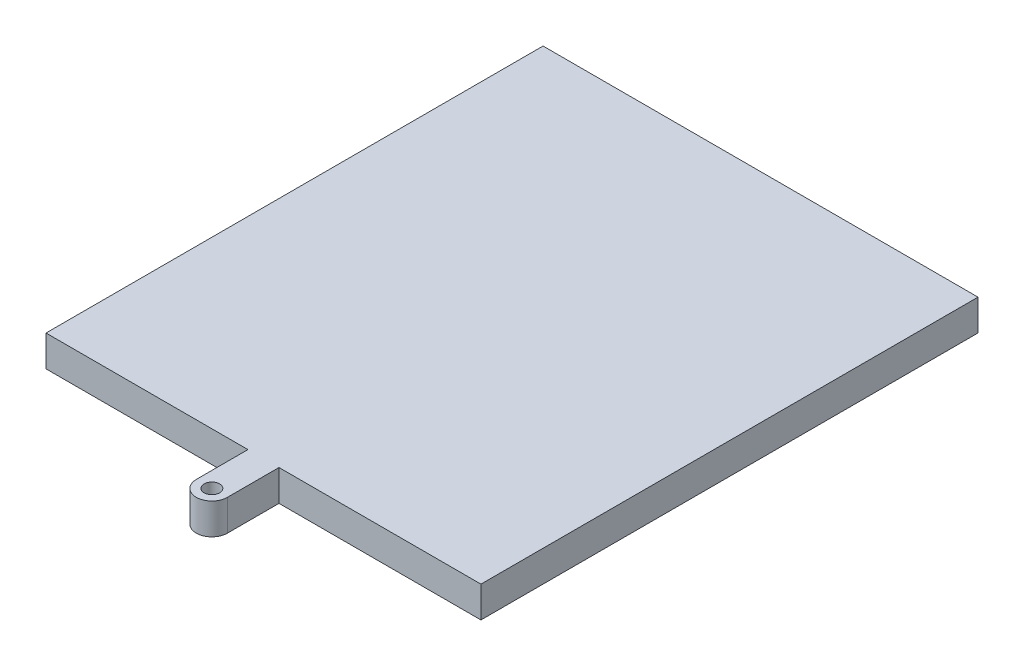
ISO-10303-21;
HEADER;
FILE_DESCRIPTION(('STEP AP214'),'2;1');
FILE_NAME('part.step','',(''),(''),'','','');
FILE_SCHEMA(('AUTOMOTIVE_DESIGN { 1 0 10303 214 1 1 1 1 }'));
ENDSEC;
DATA;
#1=APPLICATION_CONTEXT('core data for automotive mechanical design processes');
#2=APPLICATION_PROTOCOL_DEFINITION('international standard','automotive_design',2000,#1);
#3=PRODUCT_CONTEXT('',#1,'mechanical');
#4=PRODUCT('Part','Part','',(#3));
#5=PRODUCT_RELATED_PRODUCT_CATEGORY('part','',(#4));
#6=PRODUCT_DEFINITION_FORMATION('','',#4);
#7=PRODUCT_DEFINITION_CONTEXT('part definition',#1,'design');
#8=PRODUCT_DEFINITION('design','',#6,#7);
#9=PRODUCT_DEFINITION_SHAPE('','',#8);
#10=(LENGTH_UNIT() NAMED_UNIT(*) SI_UNIT(.MILLI.,.METRE.));
#11=(NAMED_UNIT(*) PLANE_ANGLE_UNIT() SI_UNIT($,.RADIAN.));
#12=(NAMED_UNIT(*) SI_UNIT($,.STERADIAN.) SOLID_ANGLE_UNIT());
#13=UNCERTAINTY_MEASURE_WITH_UNIT(LENGTH_MEASURE(1.E-05),#10,'distance_accuracy_value','');
#14=(GEOMETRIC_REPRESENTATION_CONTEXT(3) GLOBAL_UNCERTAINTY_ASSIGNED_CONTEXT((#13)) GLOBAL_UNIT_ASSIGNED_CONTEXT((#10,
#11,#12)) REPRESENTATION_CONTEXT('',''));
#15=CARTESIAN_POINT('',(0.,0.,0.));
#16=DIRECTION('',(0.,0.,1.));
#17=DIRECTION('',(1.,0.,0.));
#18=AXIS2_PLACEMENT_3D('',#15,#16,#17);
#19=CARTESIAN_POINT('',(-70.,5.,0.));
#20=DIRECTION('',(1.,0.,0.));
#21=DIRECTION('',(0.,0.,-1.));
#22=AXIS2_PLACEMENT_3D('',#19,#20,#21);
#23=PLANE('',#22);
#24=DIRECTION('',(0.,0.,1.));
#25=VECTOR('',#24,1.);
#26=CARTESIAN_POINT('',(-70.,0.,0.));
#27=LINE('',#26,#25);
#28=CARTESIAN_POINT('',(-70.,0.,0.));
#29=VERTEX_POINT('',#28);
#30=CARTESIAN_POINT('',(-70.,0.,80.));
#31=VERTEX_POINT('',#30);
#32=EDGE_CURVE('E134',#29,#31,#27,.T.);
#33=ORIENTED_EDGE('',*,*,#32,.T.);
#34=DIRECTION('',(0.,-1.,0.));
#35=VECTOR('',#34,1.);
#36=CARTESIAN_POINT('',(-70.,5.,80.));
#37=LINE('',#36,#35);
#38=CARTESIAN_POINT('',(-70.,5.,80.));
#39=VERTEX_POINT('',#38);
#40=EDGE_CURVE('E11',#39,#31,#37,.T.);
#41=ORIENTED_EDGE('',*,*,#40,.F.);
#42=DIRECTION('',(0.,0.,1.));
#43=VECTOR('',#42,1.);
#44=CARTESIAN_POINT('',(-70.,5.,0.));
#45=LINE('',#44,#43);
#46=CARTESIAN_POINT('',(-70.,5.,0.));
#47=VERTEX_POINT('',#46);
#48=EDGE_CURVE('E87',#47,#39,#45,.T.);
#49=ORIENTED_EDGE('',*,*,#48,.F.);
#50=DIRECTION('',(0.,-1.,0.));
#51=VECTOR('',#50,1.);
#52=CARTESIAN_POINT('',(-70.,5.,0.));
#53=LINE('',#52,#51);
#54=EDGE_CURVE('E133',#47,#29,#53,.T.);
#55=ORIENTED_EDGE('',*,*,#54,.T.);
#56=EDGE_LOOP('',(#33,#41,#49,#55));
#57=FACE_BOUND('',#56,.T.);
#58=ADVANCED_FACE('F35',(#57),#23,.F.);
#59=CARTESIAN_POINT('',(0.,5.,80.));
#60=DIRECTION('',(0.,0.,1.));
#61=DIRECTION('',(1.,0.,0.));
#62=AXIS2_PLACEMENT_3D('',#59,#60,#61);
#63=PLANE('',#62);
#64=DIRECTION('',(-1.,0.,0.));
#65=VECTOR('',#64,1.);
#66=CARTESIAN_POINT('',(0.,0.,80.));
#67=LINE('',#66,#65);
#68=CARTESIAN_POINT('',(-37.5,0.,80.));
#69=VERTEX_POINT('',#68);
#70=EDGE_CURVE('E137',#69,#31,#67,.T.);
#71=ORIENTED_EDGE('',*,*,#70,.F.);
#72=DIRECTION('',(0.,-1.,0.));
#73=VECTOR('',#72,1.);
#74=CARTESIAN_POINT('',(-37.5,5.,80.));
#75=LINE('',#74,#73);
#76=CARTESIAN_POINT('',(-37.5,5.,80.));
#77=VERTEX_POINT('',#76);
#78=EDGE_CURVE('E43',#77,#69,#75,.T.);
#79=ORIENTED_EDGE('',*,*,#78,.F.);
#80=DIRECTION('',(-1.,0.,0.));
#81=VECTOR('',#80,1.);
#82=CARTESIAN_POINT('',(0.,5.,80.));
#83=LINE('',#82,#81);
#84=EDGE_CURVE('E123',#77,#39,#83,.T.);
#85=ORIENTED_EDGE('',*,*,#84,.T.);
#86=ORIENTED_EDGE('',*,*,#40,.T.);
#87=EDGE_LOOP('',(#71,#79,#85,#86));
#88=FACE_BOUND('',#87,.T.);
#89=ADVANCED_FACE('F170',(#88),#63,.T.);
#90=CARTESIAN_POINT('',(-37.5,5.,0.));
#91=DIRECTION('',(-1.,0.,0.));
#92=DIRECTION('',(0.,0.,1.));
#93=AXIS2_PLACEMENT_3D('',#90,#91,#92);
#94=PLANE('',#93);
#95=DIRECTION('',(0.,0.,-1.));
#96=VECTOR('',#95,1.);
#97=CARTESIAN_POINT('',(-37.5,0.,0.));
#98=LINE('',#97,#96);
#99=CARTESIAN_POINT('',(-37.5,0.,88.3053705332621));
#100=VERTEX_POINT('',#99);
#101=EDGE_CURVE('E140',#100,#69,#98,.T.);
#102=ORIENTED_EDGE('',*,*,#101,.F.);
#103=DIRECTION('',(0.,-1.,0.));
#104=VECTOR('',#103,1.);
#105=CARTESIAN_POINT('',(-37.5,5.,88.3053705332621));
#106=LINE('',#105,#104);
#107=CARTESIAN_POINT('',(-37.5,5.,88.3053705332621));
#108=VERTEX_POINT('',#107);
#109=EDGE_CURVE('E160',#108,#100,#106,.T.);
#110=ORIENTED_EDGE('',*,*,#109,.F.);
#111=DIRECTION('',(0.,0.,-1.));
#112=VECTOR('',#111,1.);
#113=CARTESIAN_POINT('',(-37.5,5.,0.));
#114=LINE('',#113,#112);
#115=EDGE_CURVE('E167',#108,#77,#114,.T.);
#116=ORIENTED_EDGE('',*,*,#115,.T.);
#117=ORIENTED_EDGE('',*,*,#78,.T.);
#118=EDGE_LOOP('',(#102,#110,#116,#117));
#119=FACE_BOUND('',#118,.T.);
#120=ADVANCED_FACE('F165',(#119),#94,.T.);
#121=CARTESIAN_POINT('',(-35.,5.,88.3053705332621));
#122=DIRECTION('',(0.,-1.,0.));
#123=DIRECTION('',(0.,0.,-1.));
#124=AXIS2_PLACEMENT_3D('',#121,#122,#123);
#125=CYLINDRICAL_SURFACE('',#124,2.5);
#126=CARTESIAN_POINT('',(-35.,0.,88.3053705332621));
#127=DIRECTION('',(0.,1.,0.));
#128=DIRECTION('',(0.,0.,1.));
#129=AXIS2_PLACEMENT_3D('',#126,#127,#128);
#130=CIRCLE('',#129,2.5);
#131=CARTESIAN_POINT('',(-32.5,0.,88.3053705332621));
#132=VERTEX_POINT('',#131);
#133=EDGE_CURVE('E143',#100,#132,#130,.T.);
#134=ORIENTED_EDGE('',*,*,#133,.T.);
#135=DIRECTION('',(0.,-1.,0.));
#136=VECTOR('',#135,1.);
#137=CARTESIAN_POINT('',(-32.5,5.,88.3053705332621));
#138=LINE('',#137,#136);
#139=CARTESIAN_POINT('',(-32.5,5.,88.3053705332621));
#140=VERTEX_POINT('',#139);
#141=EDGE_CURVE('E157',#140,#132,#138,.T.);
#142=ORIENTED_EDGE('',*,*,#141,.F.);
#143=CARTESIAN_POINT('',(-35.,5.,88.3053705332621));
#144=DIRECTION('',(0.,1.,0.));
#145=DIRECTION('',(0.,0.,1.));
#146=AXIS2_PLACEMENT_3D('',#143,#144,#145);
#147=CIRCLE('',#146,2.5);
#148=EDGE_CURVE('E183',#108,#140,#147,.T.);
#149=ORIENTED_EDGE('',*,*,#148,.F.);
#150=ORIENTED_EDGE('',*,*,#109,.T.);
#151=EDGE_LOOP('',(#134,#142,#149,#150));
#152=FACE_BOUND('',#151,.T.);
#153=ADVANCED_FACE('F179',(#152),#125,.T.);
#154=CARTESIAN_POINT('',(-32.5,5.,0.));
#155=DIRECTION('',(-1.,0.,0.));
#156=DIRECTION('',(0.,0.,1.));
#157=AXIS2_PLACEMENT_3D('',#154,#155,#156);
#158=PLANE('',#157);
#159=DIRECTION('',(0.,0.,-1.));
#160=VECTOR('',#159,1.);
#161=CARTESIAN_POINT('',(-32.5,0.,0.));
#162=LINE('',#161,#160);
#163=CARTESIAN_POINT('',(-32.5,0.,80.));
#164=VERTEX_POINT('',#163);
#165=EDGE_CURVE('E145',#132,#164,#162,.T.);
#166=ORIENTED_EDGE('',*,*,#165,.T.);
#167=DIRECTION('',(0.,-1.,0.));
#168=VECTOR('',#167,1.);
#169=CARTESIAN_POINT('',(-32.5,5.,80.));
#170=LINE('',#169,#168);
#171=CARTESIAN_POINT('',(-32.5,5.,80.));
#172=VERTEX_POINT('',#171);
#173=EDGE_CURVE('E114',#172,#164,#170,.T.);
#174=ORIENTED_EDGE('',*,*,#173,.F.);
#175=DIRECTION('',(0.,0.,-1.));
#176=VECTOR('',#175,1.);
#177=CARTESIAN_POINT('',(-32.5,5.,0.));
#178=LINE('',#177,#176);
#179=EDGE_CURVE('E120',#140,#172,#178,.T.);
#180=ORIENTED_EDGE('',*,*,#179,.F.);
#181=ORIENTED_EDGE('',*,*,#141,.T.);
#182=EDGE_LOOP('',(#166,#174,#180,#181));
#183=FACE_BOUND('',#182,.T.);
#184=ADVANCED_FACE('F182',(#183),#158,.F.);
#185=CARTESIAN_POINT('',(0.,0.,80.));
#186=VERTEX_POINT('',#185);
#187=EDGE_CURVE('E109',#186,#164,#67,.T.);
#188=ORIENTED_EDGE('',*,*,#187,.F.);
#189=DIRECTION('',(0.,-1.,0.));
#190=VECTOR('',#189,1.);
#191=CARTESIAN_POINT('',(0.,5.,80.));
#192=LINE('',#191,#190);
#193=CARTESIAN_POINT('',(0.,5.,80.));
#194=VERTEX_POINT('',#193);
#195=EDGE_CURVE('E104',#194,#186,#192,.T.);
#196=ORIENTED_EDGE('',*,*,#195,.F.);
#197=EDGE_CURVE('E107',#194,#172,#83,.T.);
#198=ORIENTED_EDGE('',*,*,#197,.T.);
#199=ORIENTED_EDGE('',*,*,#173,.T.);
#200=EDGE_LOOP('',(#188,#196,#198,#199));
#201=FACE_BOUND('',#200,.T.);
#202=ADVANCED_FACE('F106',(#201),#63,.T.);
#203=CARTESIAN_POINT('',(0.,5.,0.));
#204=DIRECTION('',(1.,0.,0.));
#205=DIRECTION('',(0.,0.,-1.));
#206=AXIS2_PLACEMENT_3D('',#203,#204,#205);
#207=PLANE('',#206);
#208=DIRECTION('',(0.,0.,1.));
#209=VECTOR('',#208,1.);
#210=CARTESIAN_POINT('',(0.,0.,0.));
#211=LINE('',#210,#209);
#212=CARTESIAN_POINT('',(0.,0.,0.));
#213=VERTEX_POINT('',#212);
#214=EDGE_CURVE('E148',#213,#186,#211,.T.);
#215=ORIENTED_EDGE('',*,*,#214,.F.);
#216=DIRECTION('',(0.,-1.,0.));
#217=VECTOR('',#216,1.);
#218=CARTESIAN_POINT('',(0.,5.,0.));
#219=LINE('',#218,#217);
#220=CARTESIAN_POINT('',(0.,5.,0.));
#221=VERTEX_POINT('',#220);
#222=EDGE_CURVE('E78',#221,#213,#219,.T.);
#223=ORIENTED_EDGE('',*,*,#222,.F.);
#224=DIRECTION('',(0.,0.,1.));
#225=VECTOR('',#224,1.);
#226=CARTESIAN_POINT('',(0.,5.,0.));
#227=LINE('',#226,#225);
#228=EDGE_CURVE('E118',#221,#194,#227,.T.);
#229=ORIENTED_EDGE('',*,*,#228,.T.);
#230=ORIENTED_EDGE('',*,*,#195,.T.);
#231=EDGE_LOOP('',(#215,#223,#229,#230));
#232=FACE_BOUND('',#231,.T.);
#233=ADVANCED_FACE('F124',(#232),#207,.T.);
#234=CARTESIAN_POINT('',(0.,5.,0.));
#235=DIRECTION('',(0.,0.,1.));
#236=DIRECTION('',(1.,0.,0.));
#237=AXIS2_PLACEMENT_3D('',#234,#235,#236);
#238=PLANE('',#237);
#239=DIRECTION('',(-1.,0.,0.));
#240=VECTOR('',#239,1.);
#241=CARTESIAN_POINT('',(0.,0.,0.));
#242=LINE('',#241,#240);
#243=EDGE_CURVE('E81',#213,#29,#242,.T.);
#244=ORIENTED_EDGE('',*,*,#243,.T.);
#245=ORIENTED_EDGE('',*,*,#54,.F.);
#246=DIRECTION('',(-1.,0.,0.));
#247=VECTOR('',#246,1.);
#248=CARTESIAN_POINT('',(0.,5.,0.));
#249=LINE('',#248,#247);
#250=EDGE_CURVE('E51',#221,#47,#249,.T.);
#251=ORIENTED_EDGE('',*,*,#250,.F.);
#252=ORIENTED_EDGE('',*,*,#222,.T.);
#253=EDGE_LOOP('',(#244,#245,#251,#252));
#254=FACE_BOUND('',#253,.T.);
#255=ADVANCED_FACE('F187',(#254),#238,.F.);
#256=CARTESIAN_POINT('',(-35.,5.,88.3053705332621));
#257=DIRECTION('',(0.,-1.,0.));
#258=DIRECTION('',(0.,0.,-1.));
#259=AXIS2_PLACEMENT_3D('',#256,#257,#258);
#260=CYLINDRICAL_SURFACE('',#259,1.25);
#261=CARTESIAN_POINT('',(-35.,5.,88.3053705332621));
#262=DIRECTION('',(0.,1.,0.));
#263=DIRECTION('',(0.,0.,1.));
#264=AXIS2_PLACEMENT_3D('',#261,#262,#263);
#265=CIRCLE('',#264,1.25);
#266=CARTESIAN_POINT('',(-35.,5.,89.5553705332621));
#267=VERTEX_POINT('',#266);
#268=EDGE_CURVE('E126',#267,#267,#265,.T.);
#269=ORIENTED_EDGE('',*,*,#268,.T.);
#270=EDGE_LOOP('',(#269));
#271=FACE_BOUND('',#270,.T.);
#272=CARTESIAN_POINT('',(-35.,0.,88.3053705332621));
#273=DIRECTION('',(0.,1.,0.));
#274=DIRECTION('',(0.,0.,1.));
#275=AXIS2_PLACEMENT_3D('',#272,#273,#274);
#276=CIRCLE('',#275,1.25);
#277=CARTESIAN_POINT('',(-35.,0.,89.5553705332621));
#278=VERTEX_POINT('',#277);
#279=EDGE_CURVE('E151',#278,#278,#276,.T.);
#280=ORIENTED_EDGE('',*,*,#279,.F.);
#281=EDGE_LOOP('',(#280));
#282=FACE_BOUND('',#281,.T.);
#283=ADVANCED_FACE('F189',(#271,#282),#260,.F.);
#284=CARTESIAN_POINT('',(0.,5.,0.));
#285=DIRECTION('',(0.,1.,0.));
#286=DIRECTION('',(0.,0.,1.));
#287=AXIS2_PLACEMENT_3D('',#284,#285,#286);
#288=PLANE('',#287);
#289=ORIENTED_EDGE('',*,*,#48,.T.);
#290=ORIENTED_EDGE('',*,*,#84,.F.);
#291=ORIENTED_EDGE('',*,*,#115,.F.);
#292=ORIENTED_EDGE('',*,*,#148,.T.);
#293=ORIENTED_EDGE('',*,*,#179,.T.);
#294=ORIENTED_EDGE('',*,*,#197,.F.);
#295=ORIENTED_EDGE('',*,*,#228,.F.);
#296=ORIENTED_EDGE('',*,*,#250,.T.);
#297=EDGE_LOOP('',(#289,#290,#291,#292,#293,#294,#295,#296));
#298=FACE_BOUND('',#297,.T.);
#299=ORIENTED_EDGE('',*,*,#268,.F.);
#300=EDGE_LOOP('',(#299));
#301=FACE_BOUND('',#300,.T.);
#302=ADVANCED_FACE('F116',(#298,#301),#288,.T.);
#303=CARTESIAN_POINT('',(0.,0.,0.));
#304=DIRECTION('',(0.,1.,0.));
#305=DIRECTION('',(0.,0.,1.));
#306=AXIS2_PLACEMENT_3D('',#303,#304,#305);
#307=PLANE('',#306);
#308=ORIENTED_EDGE('',*,*,#32,.F.);
#309=ORIENTED_EDGE('',*,*,#243,.F.);
#310=ORIENTED_EDGE('',*,*,#214,.T.);
#311=ORIENTED_EDGE('',*,*,#187,.T.);
#312=ORIENTED_EDGE('',*,*,#165,.F.);
#313=ORIENTED_EDGE('',*,*,#133,.F.);
#314=ORIENTED_EDGE('',*,*,#101,.T.);
#315=ORIENTED_EDGE('',*,*,#70,.T.);
#316=EDGE_LOOP('',(#308,#309,#310,#311,#312,#313,#314,#315));
#317=FACE_BOUND('',#316,.T.);
#318=ORIENTED_EDGE('',*,*,#279,.T.);
#319=EDGE_LOOP('',(#318));
#320=FACE_BOUND('',#319,.T.);
#321=ADVANCED_FACE('F174',(#317,#320),#307,.F.);
#322=CLOSED_SHELL('',(#58,#89,#120,#153,#184,#202,#233,#255,#283,#302,#321));
#323=MANIFOLD_SOLID_BREP('B2',#322);
#324=ADVANCED_BREP_SHAPE_REPRESENTATION('',(#18,#323),#14);
#325=SHAPE_DEFINITION_REPRESENTATION(#9,#324);
ENDSEC;
END-ISO-10303-21;
